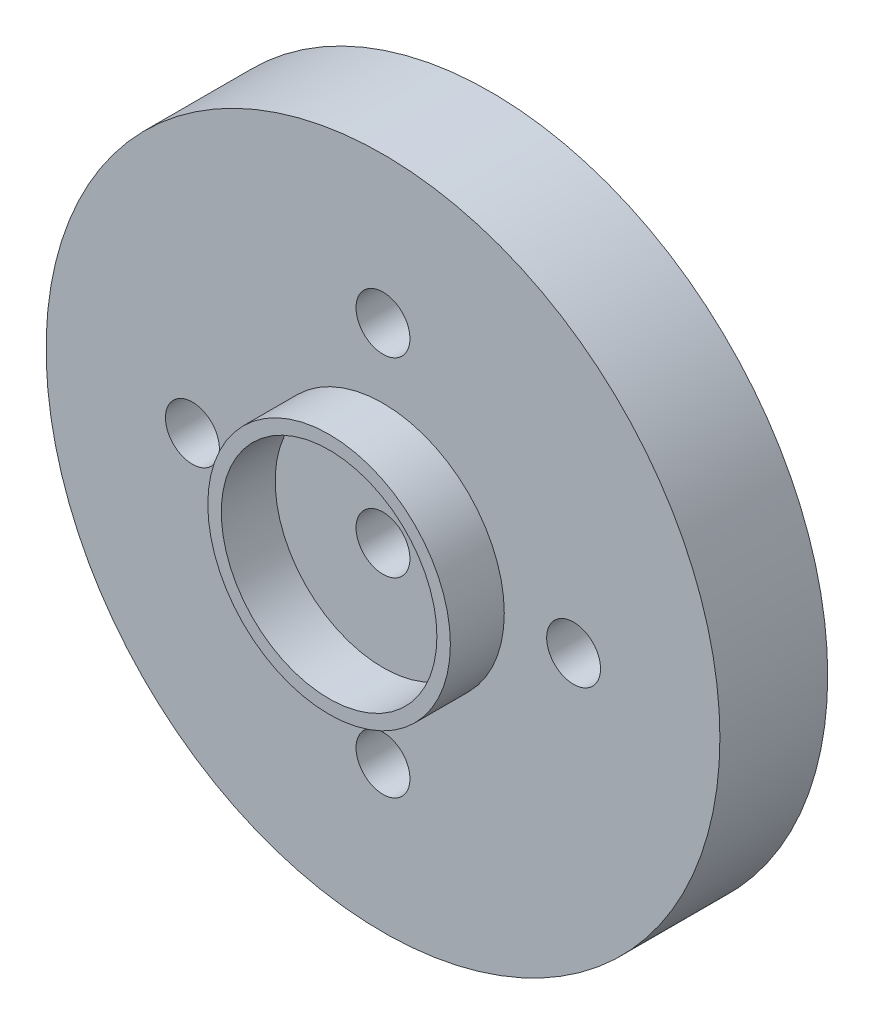
ISO-10303-21;
HEADER;
FILE_DESCRIPTION(('STEP AP214'),'2;1');
FILE_NAME('part.step','',(''),(''),'','','');
FILE_SCHEMA(('AUTOMOTIVE_DESIGN { 1 0 10303 214 1 1 1 1 }'));
ENDSEC;
DATA;
#1=APPLICATION_CONTEXT('core data for automotive mechanical design processes');
#2=APPLICATION_PROTOCOL_DEFINITION('international standard','automotive_design',2000,#1);
#3=PRODUCT_CONTEXT('',#1,'mechanical');
#4=PRODUCT('Part','Part','',(#3));
#5=PRODUCT_RELATED_PRODUCT_CATEGORY('part','',(#4));
#6=PRODUCT_DEFINITION_FORMATION('','',#4);
#7=PRODUCT_DEFINITION_CONTEXT('part definition',#1,'design');
#8=PRODUCT_DEFINITION('design','',#6,#7);
#9=PRODUCT_DEFINITION_SHAPE('','',#8);
#10=(LENGTH_UNIT() NAMED_UNIT(*) SI_UNIT(.MILLI.,.METRE.));
#11=(NAMED_UNIT(*) PLANE_ANGLE_UNIT() SI_UNIT($,.RADIAN.));
#12=(NAMED_UNIT(*) SI_UNIT($,.STERADIAN.) SOLID_ANGLE_UNIT());
#13=UNCERTAINTY_MEASURE_WITH_UNIT(LENGTH_MEASURE(1.E-05),#10,'distance_accuracy_value','');
#14=(GEOMETRIC_REPRESENTATION_CONTEXT(3) GLOBAL_UNCERTAINTY_ASSIGNED_CONTEXT((#13)) GLOBAL_UNIT_ASSIGNED_CONTEXT((#10,
#11,#12)) REPRESENTATION_CONTEXT('',''));
#15=CARTESIAN_POINT('',(0.,0.,0.));
#16=DIRECTION('',(0.,0.,1.));
#17=DIRECTION('',(1.,0.,0.));
#18=AXIS2_PLACEMENT_3D('',#15,#16,#17);
#19=CARTESIAN_POINT('',(0.,0.,4.));
#20=DIRECTION('',(0.,0.,-1.));
#21=DIRECTION('',(-1.,0.,0.));
#22=AXIS2_PLACEMENT_3D('',#19,#20,#21);
#23=CYLINDRICAL_SURFACE('',#22,12.5);
#24=CARTESIAN_POINT('',(0.,0.,4.));
#25=DIRECTION('',(0.,0.,1.));
#26=DIRECTION('',(1.,0.,0.));
#27=AXIS2_PLACEMENT_3D('',#24,#25,#26);
#28=CIRCLE('',#27,12.5);
#29=CARTESIAN_POINT('',(12.5,0.,4.));
#30=VERTEX_POINT('',#29);
#31=EDGE_CURVE('E47',#30,#30,#28,.T.);
#32=ORIENTED_EDGE('',*,*,#31,.F.);
#33=EDGE_LOOP('',(#32));
#34=FACE_BOUND('',#33,.T.);
#35=CARTESIAN_POINT('',(0.,0.,0.));
#36=DIRECTION('',(0.,0.,1.));
#37=DIRECTION('',(1.,0.,0.));
#38=AXIS2_PLACEMENT_3D('',#35,#36,#37);
#39=CIRCLE('',#38,12.5);
#40=CARTESIAN_POINT('',(12.5,0.,0.));
#41=VERTEX_POINT('',#40);
#42=EDGE_CURVE('E43',#41,#41,#39,.T.);
#43=ORIENTED_EDGE('',*,*,#42,.T.);
#44=EDGE_LOOP('',(#43));
#45=FACE_BOUND('',#44,.T.);
#46=ADVANCED_FACE('F40',(#34,#45),#23,.T.);
#47=CARTESIAN_POINT('',(0.,0.,4.));
#48=DIRECTION('',(0.,0.,1.));
#49=DIRECTION('',(1.,0.,0.));
#50=AXIS2_PLACEMENT_3D('',#47,#48,#49);
#51=PLANE('',#50);
#52=CARTESIAN_POINT('',(-7.07106781186547,0.,4.));
#53=DIRECTION('',(0.,0.,-1.));
#54=DIRECTION('',(-1.,0.,0.));
#55=AXIS2_PLACEMENT_3D('',#52,#53,#54);
#56=CIRCLE('',#55,1.);
#57=CARTESIAN_POINT('',(-8.07106781186547,0.,4.));
#58=VERTEX_POINT('',#57);
#59=EDGE_CURVE('E60',#58,#58,#56,.T.);
#60=ORIENTED_EDGE('',*,*,#59,.T.);
#61=EDGE_LOOP('',(#60));
#62=FACE_BOUND('',#61,.T.);
#63=CARTESIAN_POINT('',(0.,-7.07106781186547,4.));
#64=DIRECTION('',(0.,0.,-1.));
#65=DIRECTION('',(-1.,0.,0.));
#66=AXIS2_PLACEMENT_3D('',#63,#64,#65);
#67=CIRCLE('',#66,1.);
#68=CARTESIAN_POINT('',(-1.,-7.07106781186547,4.));
#69=VERTEX_POINT('',#68);
#70=EDGE_CURVE('E83',#69,#69,#67,.T.);
#71=ORIENTED_EDGE('',*,*,#70,.T.);
#72=EDGE_LOOP('',(#71));
#73=FACE_BOUND('',#72,.T.);
#74=CARTESIAN_POINT('',(7.07106781186547,0.,4.));
#75=DIRECTION('',(0.,0.,-1.));
#76=DIRECTION('',(-1.,0.,0.));
#77=AXIS2_PLACEMENT_3D('',#74,#75,#76);
#78=CIRCLE('',#77,1.);
#79=CARTESIAN_POINT('',(6.07106781186547,0.,4.));
#80=VERTEX_POINT('',#79);
#81=EDGE_CURVE('E63',#80,#80,#78,.T.);
#82=ORIENTED_EDGE('',*,*,#81,.T.);
#83=EDGE_LOOP('',(#82));
#84=FACE_BOUND('',#83,.T.);
#85=CARTESIAN_POINT('',(0.,7.07106781186547,4.));
#86=DIRECTION('',(0.,0.,-1.));
#87=DIRECTION('',(-1.,0.,0.));
#88=AXIS2_PLACEMENT_3D('',#85,#86,#87);
#89=CIRCLE('',#88,1.);
#90=CARTESIAN_POINT('',(-1.,7.07106781186547,4.));
#91=VERTEX_POINT('',#90);
#92=EDGE_CURVE('E70',#91,#91,#89,.T.);
#93=ORIENTED_EDGE('',*,*,#92,.T.);
#94=EDGE_LOOP('',(#93));
#95=FACE_BOUND('',#94,.T.);
#96=CARTESIAN_POINT('',(0.,0.,4.));
#97=DIRECTION('',(0.,0.,1.));
#98=DIRECTION('',(1.,0.,0.));
#99=AXIS2_PLACEMENT_3D('',#96,#97,#98);
#100=CIRCLE('',#99,4.5);
#101=CARTESIAN_POINT('',(4.5,0.,4.));
#102=VERTEX_POINT('',#101);
#103=EDGE_CURVE('E11',#102,#102,#100,.T.);
#104=ORIENTED_EDGE('',*,*,#103,.F.);
#105=EDGE_LOOP('',(#104));
#106=FACE_BOUND('',#105,.T.);
#107=ORIENTED_EDGE('',*,*,#31,.T.);
#108=EDGE_LOOP('',(#107));
#109=FACE_BOUND('',#108,.T.);
#110=ADVANCED_FACE('F93',(#62,#73,#84,#95,#106,#109),#51,.T.);
#111=CARTESIAN_POINT('',(0.,0.,0.));
#112=DIRECTION('',(0.,0.,1.));
#113=DIRECTION('',(1.,0.,0.));
#114=AXIS2_PLACEMENT_3D('',#111,#112,#113);
#115=PLANE('',#114);
#116=CARTESIAN_POINT('',(-7.07106781186547,0.,0.));
#117=DIRECTION('',(0.,0.,-1.));
#118=DIRECTION('',(-1.,0.,0.));
#119=AXIS2_PLACEMENT_3D('',#116,#117,#118);
#120=CIRCLE('',#119,1.);
#121=CARTESIAN_POINT('',(-8.07106781186547,0.,0.));
#122=VERTEX_POINT('',#121);
#123=EDGE_CURVE('E76',#122,#122,#120,.T.);
#124=ORIENTED_EDGE('',*,*,#123,.F.);
#125=EDGE_LOOP('',(#124));
#126=FACE_BOUND('',#125,.T.);
#127=CARTESIAN_POINT('',(0.,0.,0.));
#128=DIRECTION('',(0.,0.,-1.));
#129=DIRECTION('',(-1.,0.,0.));
#130=AXIS2_PLACEMENT_3D('',#127,#128,#129);
#131=CIRCLE('',#130,1.);
#132=CARTESIAN_POINT('',(-1.,0.,0.));
#133=VERTEX_POINT('',#132);
#134=EDGE_CURVE('E80',#133,#133,#131,.T.);
#135=ORIENTED_EDGE('',*,*,#134,.F.);
#136=EDGE_LOOP('',(#135));
#137=FACE_BOUND('',#136,.T.);
#138=CARTESIAN_POINT('',(0.,-7.07106781186547,0.));
#139=DIRECTION('',(0.,0.,-1.));
#140=DIRECTION('',(-1.,0.,0.));
#141=AXIS2_PLACEMENT_3D('',#138,#139,#140);
#142=CIRCLE('',#141,1.);
#143=CARTESIAN_POINT('',(-1.,-7.07106781186547,0.));
#144=VERTEX_POINT('',#143);
#145=EDGE_CURVE('E67',#144,#144,#142,.T.);
#146=ORIENTED_EDGE('',*,*,#145,.F.);
#147=EDGE_LOOP('',(#146));
#148=FACE_BOUND('',#147,.T.);
#149=CARTESIAN_POINT('',(7.07106781186547,0.,0.));
#150=DIRECTION('',(0.,0.,-1.));
#151=DIRECTION('',(-1.,0.,0.));
#152=AXIS2_PLACEMENT_3D('',#149,#150,#151);
#153=CIRCLE('',#152,1.);
#154=CARTESIAN_POINT('',(6.07106781186547,0.,0.));
#155=VERTEX_POINT('',#154);
#156=EDGE_CURVE('E66',#155,#155,#153,.T.);
#157=ORIENTED_EDGE('',*,*,#156,.F.);
#158=EDGE_LOOP('',(#157));
#159=FACE_BOUND('',#158,.T.);
#160=CARTESIAN_POINT('',(0.,7.07106781186547,0.));
#161=DIRECTION('',(0.,0.,-1.));
#162=DIRECTION('',(-1.,0.,0.));
#163=AXIS2_PLACEMENT_3D('',#160,#161,#162);
#164=CIRCLE('',#163,1.);
#165=CARTESIAN_POINT('',(-1.,7.07106781186547,0.));
#166=VERTEX_POINT('',#165);
#167=EDGE_CURVE('E73',#166,#166,#164,.T.);
#168=ORIENTED_EDGE('',*,*,#167,.F.);
#169=EDGE_LOOP('',(#168));
#170=FACE_BOUND('',#169,.T.);
#171=ORIENTED_EDGE('',*,*,#42,.F.);
#172=EDGE_LOOP('',(#171));
#173=FACE_BOUND('',#172,.T.);
#174=ADVANCED_FACE('F103',(#126,#137,#148,#159,#170,#173),#115,.F.);
#175=CARTESIAN_POINT('',(0.,0.,6.));
#176=DIRECTION('',(0.,0.,-1.));
#177=DIRECTION('',(-1.,0.,0.));
#178=AXIS2_PLACEMENT_3D('',#175,#176,#177);
#179=CYLINDRICAL_SURFACE('',#178,4.5);
#180=CARTESIAN_POINT('',(0.,0.,6.));
#181=DIRECTION('',(0.,0.,1.));
#182=DIRECTION('',(1.,0.,0.));
#183=AXIS2_PLACEMENT_3D('',#180,#181,#182);
#184=CIRCLE('',#183,4.5);
#185=CARTESIAN_POINT('',(4.5,0.,6.));
#186=VERTEX_POINT('',#185);
#187=EDGE_CURVE('E53',#186,#186,#184,.T.);
#188=ORIENTED_EDGE('',*,*,#187,.F.);
#189=EDGE_LOOP('',(#188));
#190=FACE_BOUND('',#189,.T.);
#191=ORIENTED_EDGE('',*,*,#103,.T.);
#192=EDGE_LOOP('',(#191));
#193=FACE_BOUND('',#192,.T.);
#194=ADVANCED_FACE('F106',(#190,#193),#179,.T.);
#195=CARTESIAN_POINT('',(0.,0.,6.));
#196=DIRECTION('',(0.,0.,1.));
#197=DIRECTION('',(1.,0.,0.));
#198=AXIS2_PLACEMENT_3D('',#195,#196,#197);
#199=PLANE('',#198);
#200=CARTESIAN_POINT('',(0.,0.,6.));
#201=DIRECTION('',(0.,0.,1.));
#202=DIRECTION('',(1.,0.,0.));
#203=AXIS2_PLACEMENT_3D('',#200,#201,#202);
#204=CIRCLE('',#203,4.);
#205=CARTESIAN_POINT('',(4.,0.,6.));
#206=VERTEX_POINT('',#205);
#207=EDGE_CURVE('E57',#206,#206,#204,.T.);
#208=ORIENTED_EDGE('',*,*,#207,.F.);
#209=EDGE_LOOP('',(#208));
#210=FACE_BOUND('',#209,.T.);
#211=ORIENTED_EDGE('',*,*,#187,.T.);
#212=EDGE_LOOP('',(#211));
#213=FACE_BOUND('',#212,.T.);
#214=ADVANCED_FACE('F131',(#210,#213),#199,.T.);
#215=CARTESIAN_POINT('',(0.,0.,4.));
#216=DIRECTION('',(0.,0.,1.));
#217=DIRECTION('',(1.,0.,0.));
#218=AXIS2_PLACEMENT_3D('',#215,#216,#217);
#219=PLANE('',#218);
#220=CARTESIAN_POINT('',(0.,0.,4.));
#221=DIRECTION('',(0.,0.,-1.));
#222=DIRECTION('',(-1.,0.,0.));
#223=AXIS2_PLACEMENT_3D('',#220,#221,#222);
#224=CIRCLE('',#223,1.);
#225=CARTESIAN_POINT('',(-1.,0.,4.));
#226=VERTEX_POINT('',#225);
#227=EDGE_CURVE('E77',#226,#226,#224,.T.);
#228=ORIENTED_EDGE('',*,*,#227,.T.);
#229=EDGE_LOOP('',(#228));
#230=FACE_BOUND('',#229,.T.);
#231=CARTESIAN_POINT('',(0.,0.,4.));
#232=DIRECTION('',(0.,0.,1.));
#233=DIRECTION('',(1.,0.,0.));
#234=AXIS2_PLACEMENT_3D('',#231,#232,#233);
#235=CIRCLE('',#234,4.);
#236=CARTESIAN_POINT('',(4.,0.,4.));
#237=VERTEX_POINT('',#236);
#238=EDGE_CURVE('E56',#237,#237,#235,.T.);
#239=ORIENTED_EDGE('',*,*,#238,.T.);
#240=EDGE_LOOP('',(#239));
#241=FACE_BOUND('',#240,.T.);
#242=ADVANCED_FACE('F135',(#230,#241),#219,.T.);
#243=CARTESIAN_POINT('',(0.,0.,4.));
#244=DIRECTION('',(0.,0.,1.));
#245=DIRECTION('',(1.,0.,0.));
#246=AXIS2_PLACEMENT_3D('',#243,#244,#245);
#247=CYLINDRICAL_SURFACE('',#246,4.);
#248=ORIENTED_EDGE('',*,*,#238,.F.);
#249=EDGE_LOOP('',(#248));
#250=FACE_BOUND('',#249,.T.);
#251=ORIENTED_EDGE('',*,*,#207,.T.);
#252=EDGE_LOOP('',(#251));
#253=FACE_BOUND('',#252,.T.);
#254=ADVANCED_FACE('F137',(#250,#253),#247,.F.);
#255=CARTESIAN_POINT('',(0.,7.07106781186547,4.));
#256=DIRECTION('',(0.,0.,-1.));
#257=DIRECTION('',(-1.,0.,0.));
#258=AXIS2_PLACEMENT_3D('',#255,#256,#257);
#259=CYLINDRICAL_SURFACE('',#258,1.);
#260=ORIENTED_EDGE('',*,*,#92,.F.);
#261=EDGE_LOOP('',(#260));
#262=FACE_BOUND('',#261,.T.);
#263=ORIENTED_EDGE('',*,*,#167,.T.);
#264=EDGE_LOOP('',(#263));
#265=FACE_BOUND('',#264,.T.);
#266=ADVANCED_FACE('F140',(#262,#265),#259,.F.);
#267=CARTESIAN_POINT('',(7.07106781186547,0.,4.));
#268=DIRECTION('',(0.,0.,-1.));
#269=DIRECTION('',(-1.,0.,0.));
#270=AXIS2_PLACEMENT_3D('',#267,#268,#269);
#271=CYLINDRICAL_SURFACE('',#270,1.);
#272=ORIENTED_EDGE('',*,*,#81,.F.);
#273=EDGE_LOOP('',(#272));
#274=FACE_BOUND('',#273,.T.);
#275=ORIENTED_EDGE('',*,*,#156,.T.);
#276=EDGE_LOOP('',(#275));
#277=FACE_BOUND('',#276,.T.);
#278=ADVANCED_FACE('F145',(#274,#277),#271,.F.);
#279=CARTESIAN_POINT('',(0.,-7.07106781186547,4.));
#280=DIRECTION('',(0.,0.,-1.));
#281=DIRECTION('',(-1.,0.,0.));
#282=AXIS2_PLACEMENT_3D('',#279,#280,#281);
#283=CYLINDRICAL_SURFACE('',#282,1.);
#284=ORIENTED_EDGE('',*,*,#70,.F.);
#285=EDGE_LOOP('',(#284));
#286=FACE_BOUND('',#285,.T.);
#287=ORIENTED_EDGE('',*,*,#145,.T.);
#288=EDGE_LOOP('',(#287));
#289=FACE_BOUND('',#288,.T.);
#290=ADVANCED_FACE('F148',(#286,#289),#283,.F.);
#291=CARTESIAN_POINT('',(0.,0.,4.));
#292=DIRECTION('',(0.,0.,-1.));
#293=DIRECTION('',(-1.,0.,0.));
#294=AXIS2_PLACEMENT_3D('',#291,#292,#293);
#295=CYLINDRICAL_SURFACE('',#294,1.);
#296=ORIENTED_EDGE('',*,*,#227,.F.);
#297=EDGE_LOOP('',(#296));
#298=FACE_BOUND('',#297,.T.);
#299=ORIENTED_EDGE('',*,*,#134,.T.);
#300=EDGE_LOOP('',(#299));
#301=FACE_BOUND('',#300,.T.);
#302=ADVANCED_FACE('F99',(#298,#301),#295,.F.);
#303=CARTESIAN_POINT('',(-7.07106781186547,0.,4.));
#304=DIRECTION('',(0.,0.,-1.));
#305=DIRECTION('',(-1.,0.,0.));
#306=AXIS2_PLACEMENT_3D('',#303,#304,#305);
#307=CYLINDRICAL_SURFACE('',#306,1.);
#308=ORIENTED_EDGE('',*,*,#59,.F.);
#309=EDGE_LOOP('',(#308));
#310=FACE_BOUND('',#309,.T.);
#311=ORIENTED_EDGE('',*,*,#123,.T.);
#312=EDGE_LOOP('',(#311));
#313=FACE_BOUND('',#312,.T.);
#314=ADVANCED_FACE('F96',(#310,#313),#307,.F.);
#315=CLOSED_SHELL('',(#46,#110,#174,#194,#214,#242,#254,#266,#278,#290,#302,#314));
#316=MANIFOLD_SOLID_BREP('B2',#315);
#317=ADVANCED_BREP_SHAPE_REPRESENTATION('',(#18,#316),#14);
#318=SHAPE_DEFINITION_REPRESENTATION(#9,#317);
ENDSEC;
END-ISO-10303-21;
